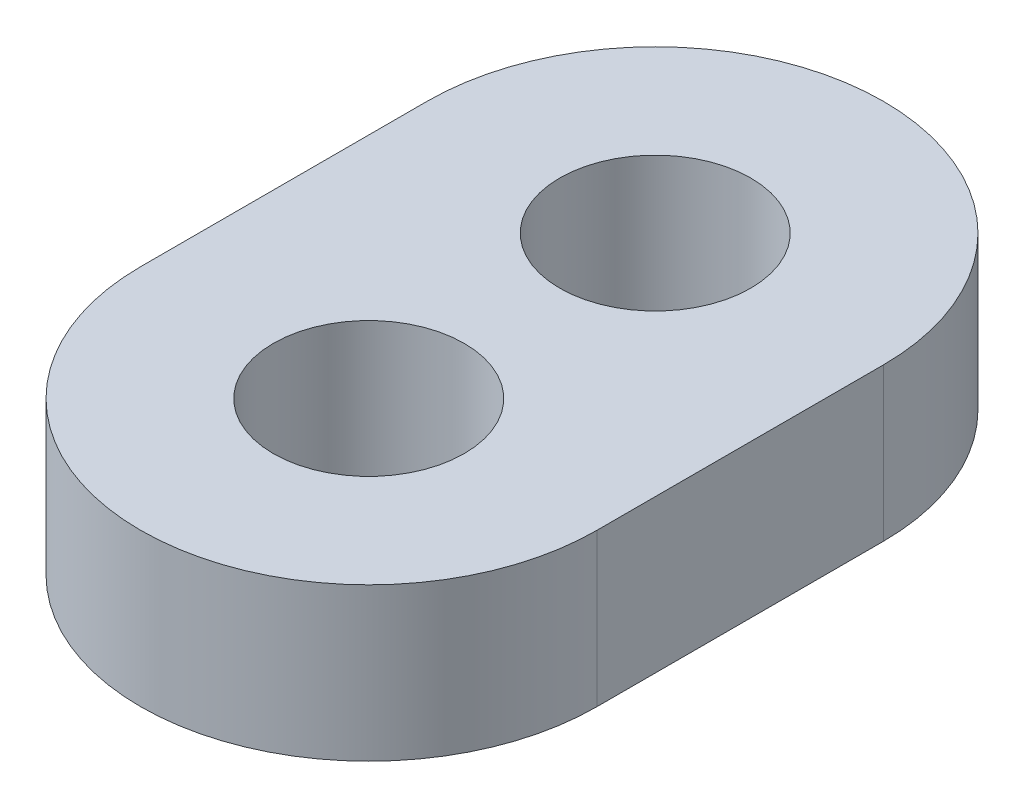
ISO-10303-21;
HEADER;
FILE_DESCRIPTION(('STEP AP214'),'2;1');
FILE_NAME('part.step','',(''),(''),'','','');
FILE_SCHEMA(('AUTOMOTIVE_DESIGN { 1 0 10303 214 1 1 1 1 }'));
ENDSEC;
DATA;
#1=APPLICATION_CONTEXT('core data for automotive mechanical design processes');
#2=APPLICATION_PROTOCOL_DEFINITION('international standard','automotive_design',2000,#1);
#3=PRODUCT_CONTEXT('',#1,'mechanical');
#4=PRODUCT('Part','Part','',(#3));
#5=PRODUCT_RELATED_PRODUCT_CATEGORY('part','',(#4));
#6=PRODUCT_DEFINITION_FORMATION('','',#4);
#7=PRODUCT_DEFINITION_CONTEXT('part definition',#1,'design');
#8=PRODUCT_DEFINITION('design','',#6,#7);
#9=PRODUCT_DEFINITION_SHAPE('','',#8);
#10=(LENGTH_UNIT() NAMED_UNIT(*) SI_UNIT(.MILLI.,.METRE.));
#11=(NAMED_UNIT(*) PLANE_ANGLE_UNIT() SI_UNIT($,.RADIAN.));
#12=(NAMED_UNIT(*) SI_UNIT($,.STERADIAN.) SOLID_ANGLE_UNIT());
#13=UNCERTAINTY_MEASURE_WITH_UNIT(LENGTH_MEASURE(1.E-05),#10,'distance_accuracy_value','');
#14=(GEOMETRIC_REPRESENTATION_CONTEXT(3) GLOBAL_UNCERTAINTY_ASSIGNED_CONTEXT((#13)) GLOBAL_UNIT_ASSIGNED_CONTEXT((#10,
#11,#12)) REPRESENTATION_CONTEXT('',''));
#15=CARTESIAN_POINT('',(0.,0.,0.));
#16=DIRECTION('',(0.,0.,1.));
#17=DIRECTION('',(1.,0.,0.));
#18=AXIS2_PLACEMENT_3D('',#15,#16,#17);
#19=CARTESIAN_POINT('',(0.,-9.,-6.5));
#20=DIRECTION('',(0.,-1.,0.));
#21=DIRECTION('',(0.,0.,-1.));
#22=AXIS2_PLACEMENT_3D('',#19,#20,#21);
#23=PLANE('',#22);
#24=CARTESIAN_POINT('',(0.,-9.,-14.));
#25=DIRECTION('',(0.,-1.,0.));
#26=DIRECTION('',(0.,0.,-1.));
#27=AXIS2_PLACEMENT_3D('',#24,#25,#26);
#28=CIRCLE('',#27,2.5);
#29=CARTESIAN_POINT('',(0.,-9.,-16.5));
#30=VERTEX_POINT('',#29);
#31=EDGE_CURVE('E100',#30,#30,#28,.T.);
#32=ORIENTED_EDGE('',*,*,#31,.F.);
#33=EDGE_LOOP('',(#32));
#34=FACE_BOUND('',#33,.T.);
#35=CARTESIAN_POINT('',(0.,-9.,-6.5));
#36=DIRECTION('',(0.,-1.,0.));
#37=DIRECTION('',(0.,0.,-1.));
#38=AXIS2_PLACEMENT_3D('',#35,#36,#37);
#39=CIRCLE('',#38,5.9750628465971);
#40=CARTESIAN_POINT('',(5.9750628465971,-9.,-6.5));
#41=VERTEX_POINT('',#40);
#42=CARTESIAN_POINT('',(-5.9750628465971,-9.,-6.5));
#43=VERTEX_POINT('',#42);
#44=EDGE_CURVE('E85',#41,#43,#39,.T.);
#45=ORIENTED_EDGE('',*,*,#44,.T.);
#46=DIRECTION('',(0.,0.,-1.));
#47=VECTOR('',#46,1.);
#48=CARTESIAN_POINT('',(-5.9750628465971,-9.,-6.5));
#49=LINE('',#48,#47);
#50=CARTESIAN_POINT('',(-5.9750628465971,-9.,-14.));
#51=VERTEX_POINT('',#50);
#52=EDGE_CURVE('E80',#43,#51,#49,.T.);
#53=ORIENTED_EDGE('',*,*,#52,.T.);
#54=CARTESIAN_POINT('',(0.,-9.,-14.));
#55=DIRECTION('',(0.,-1.,0.));
#56=DIRECTION('',(0.,0.,-1.));
#57=AXIS2_PLACEMENT_3D('',#54,#55,#56);
#58=CIRCLE('',#57,5.9750628465971);
#59=CARTESIAN_POINT('',(5.9750628465971,-9.,-14.));
#60=VERTEX_POINT('',#59);
#61=EDGE_CURVE('E83',#51,#60,#58,.T.);
#62=ORIENTED_EDGE('',*,*,#61,.T.);
#63=DIRECTION('',(0.,0.,1.));
#64=VECTOR('',#63,1.);
#65=CARTESIAN_POINT('',(5.9750628465971,-9.,-6.5));
#66=LINE('',#65,#64);
#67=EDGE_CURVE('E50',#60,#41,#66,.T.);
#68=ORIENTED_EDGE('',*,*,#67,.T.);
#69=EDGE_LOOP('',(#45,#53,#62,#68));
#70=FACE_BOUND('',#69,.T.);
#71=CARTESIAN_POINT('',(0.,-9.,-6.5));
#72=DIRECTION('',(0.,-1.,0.));
#73=DIRECTION('',(0.,0.,-1.));
#74=AXIS2_PLACEMENT_3D('',#71,#72,#73);
#75=CIRCLE('',#74,2.5);
#76=CARTESIAN_POINT('',(0.,-9.,-9.));
#77=VERTEX_POINT('',#76);
#78=EDGE_CURVE('E115',#77,#77,#75,.T.);
#79=ORIENTED_EDGE('',*,*,#78,.F.);
#80=EDGE_LOOP('',(#79));
#81=FACE_BOUND('',#80,.T.);
#82=ADVANCED_FACE('F33',(#34,#70,#81),#23,.T.);
#83=CARTESIAN_POINT('',(0.,-5.,-6.5));
#84=DIRECTION('',(0.,-1.,0.));
#85=DIRECTION('',(0.,0.,-1.));
#86=AXIS2_PLACEMENT_3D('',#83,#84,#85);
#87=PLANE('',#86);
#88=CARTESIAN_POINT('',(0.,-5.,-14.));
#89=DIRECTION('',(0.,-1.,0.));
#90=DIRECTION('',(0.,0.,-1.));
#91=AXIS2_PLACEMENT_3D('',#88,#89,#90);
#92=CIRCLE('',#91,2.5);
#93=CARTESIAN_POINT('',(0.,-5.,-16.5));
#94=VERTEX_POINT('',#93);
#95=EDGE_CURVE('E112',#94,#94,#92,.T.);
#96=ORIENTED_EDGE('',*,*,#95,.T.);
#97=EDGE_LOOP('',(#96));
#98=FACE_BOUND('',#97,.T.);
#99=CARTESIAN_POINT('',(0.,-5.,-6.5));
#100=DIRECTION('',(0.,-1.,0.));
#101=DIRECTION('',(0.,0.,-1.));
#102=AXIS2_PLACEMENT_3D('',#99,#100,#101);
#103=CIRCLE('',#102,5.9750628465971);
#104=CARTESIAN_POINT('',(5.9750628465971,-5.,-6.5));
#105=VERTEX_POINT('',#104);
#106=CARTESIAN_POINT('',(-5.9750628465971,-5.,-6.5));
#107=VERTEX_POINT('',#106);
#108=EDGE_CURVE('E97',#105,#107,#103,.T.);
#109=ORIENTED_EDGE('',*,*,#108,.F.);
#110=DIRECTION('',(0.,0.,1.));
#111=VECTOR('',#110,1.);
#112=CARTESIAN_POINT('',(5.9750628465971,-5.,-6.5));
#113=LINE('',#112,#111);
#114=CARTESIAN_POINT('',(5.9750628465971,-5.,-14.));
#115=VERTEX_POINT('',#114);
#116=EDGE_CURVE('E73',#115,#105,#113,.T.);
#117=ORIENTED_EDGE('',*,*,#116,.F.);
#118=CARTESIAN_POINT('',(0.,-5.,-14.));
#119=DIRECTION('',(0.,-1.,0.));
#120=DIRECTION('',(0.,0.,-1.));
#121=AXIS2_PLACEMENT_3D('',#118,#119,#120);
#122=CIRCLE('',#121,5.9750628465971);
#123=CARTESIAN_POINT('',(-5.9750628465971,-5.,-14.));
#124=VERTEX_POINT('',#123);
#125=EDGE_CURVE('E67',#124,#115,#122,.T.);
#126=ORIENTED_EDGE('',*,*,#125,.F.);
#127=DIRECTION('',(0.,0.,-1.));
#128=VECTOR('',#127,1.);
#129=CARTESIAN_POINT('',(-5.9750628465971,-5.,-6.5));
#130=LINE('',#129,#128);
#131=EDGE_CURVE('E89',#107,#124,#130,.T.);
#132=ORIENTED_EDGE('',*,*,#131,.F.);
#133=EDGE_LOOP('',(#109,#117,#126,#132));
#134=FACE_BOUND('',#133,.T.);
#135=CARTESIAN_POINT('',(0.,-5.,-6.5));
#136=DIRECTION('',(0.,-1.,0.));
#137=DIRECTION('',(0.,0.,-1.));
#138=AXIS2_PLACEMENT_3D('',#135,#136,#137);
#139=CIRCLE('',#138,2.5);
#140=CARTESIAN_POINT('',(0.,-5.,-9.));
#141=VERTEX_POINT('',#140);
#142=EDGE_CURVE('E118',#141,#141,#139,.T.);
#143=ORIENTED_EDGE('',*,*,#142,.T.);
#144=EDGE_LOOP('',(#143));
#145=FACE_BOUND('',#144,.T.);
#146=ADVANCED_FACE('F108',(#98,#134,#145),#87,.F.);
#147=CARTESIAN_POINT('',(0.,-9.,-6.5));
#148=DIRECTION('',(0.,1.,0.));
#149=DIRECTION('',(0.,0.,1.));
#150=AXIS2_PLACEMENT_3D('',#147,#148,#149);
#151=CYLINDRICAL_SURFACE('',#150,5.9750628465971);
#152=ORIENTED_EDGE('',*,*,#108,.T.);
#153=DIRECTION('',(0.,1.,0.));
#154=VECTOR('',#153,1.);
#155=CARTESIAN_POINT('',(-5.9750628465971,-9.,-6.5));
#156=LINE('',#155,#154);
#157=EDGE_CURVE('E11',#43,#107,#156,.T.);
#158=ORIENTED_EDGE('',*,*,#157,.F.);
#159=ORIENTED_EDGE('',*,*,#44,.F.);
#160=DIRECTION('',(0.,1.,0.));
#161=VECTOR('',#160,1.);
#162=CARTESIAN_POINT('',(5.9750628465971,-9.,-6.5));
#163=LINE('',#162,#161);
#164=EDGE_CURVE('E93',#41,#105,#163,.T.);
#165=ORIENTED_EDGE('',*,*,#164,.T.);
#166=EDGE_LOOP('',(#152,#158,#159,#165));
#167=FACE_BOUND('',#166,.T.);
#168=ADVANCED_FACE('F35',(#167),#151,.T.);
#169=CARTESIAN_POINT('',(-5.9750628465971,-9.,-6.5));
#170=DIRECTION('',(1.,0.,0.));
#171=DIRECTION('',(0.,0.,-1.));
#172=AXIS2_PLACEMENT_3D('',#169,#170,#171);
#173=PLANE('',#172);
#174=ORIENTED_EDGE('',*,*,#131,.T.);
#175=DIRECTION('',(0.,1.,0.));
#176=VECTOR('',#175,1.);
#177=CARTESIAN_POINT('',(-5.9750628465971,-9.,-14.));
#178=LINE('',#177,#176);
#179=EDGE_CURVE('E42',#51,#124,#178,.T.);
#180=ORIENTED_EDGE('',*,*,#179,.F.);
#181=ORIENTED_EDGE('',*,*,#52,.F.);
#182=ORIENTED_EDGE('',*,*,#157,.T.);
#183=EDGE_LOOP('',(#174,#180,#181,#182));
#184=FACE_BOUND('',#183,.T.);
#185=ADVANCED_FACE('F88',(#184),#173,.F.);
#186=CARTESIAN_POINT('',(0.,-9.,-14.));
#187=DIRECTION('',(0.,1.,0.));
#188=DIRECTION('',(0.,0.,1.));
#189=AXIS2_PLACEMENT_3D('',#186,#187,#188);
#190=CYLINDRICAL_SURFACE('',#189,5.9750628465971);
#191=ORIENTED_EDGE('',*,*,#125,.T.);
#192=DIRECTION('',(0.,1.,0.));
#193=VECTOR('',#192,1.);
#194=CARTESIAN_POINT('',(5.9750628465971,-9.,-14.));
#195=LINE('',#194,#193);
#196=EDGE_CURVE('E90',#60,#115,#195,.T.);
#197=ORIENTED_EDGE('',*,*,#196,.F.);
#198=ORIENTED_EDGE('',*,*,#61,.F.);
#199=ORIENTED_EDGE('',*,*,#179,.T.);
#200=EDGE_LOOP('',(#191,#197,#198,#199));
#201=FACE_BOUND('',#200,.T.);
#202=ADVANCED_FACE('F91',(#201),#190,.T.);
#203=CARTESIAN_POINT('',(5.9750628465971,-9.,-6.5));
#204=DIRECTION('',(-1.,0.,0.));
#205=DIRECTION('',(0.,0.,1.));
#206=AXIS2_PLACEMENT_3D('',#203,#204,#205);
#207=PLANE('',#206);
#208=ORIENTED_EDGE('',*,*,#116,.T.);
#209=ORIENTED_EDGE('',*,*,#164,.F.);
#210=ORIENTED_EDGE('',*,*,#67,.F.);
#211=ORIENTED_EDGE('',*,*,#196,.T.);
#212=EDGE_LOOP('',(#208,#209,#210,#211));
#213=FACE_BOUND('',#212,.T.);
#214=ADVANCED_FACE('F105',(#213),#207,.F.);
#215=CARTESIAN_POINT('',(0.,-9.,-14.));
#216=DIRECTION('',(0.,1.,0.));
#217=DIRECTION('',(0.,0.,1.));
#218=AXIS2_PLACEMENT_3D('',#215,#216,#217);
#219=CYLINDRICAL_SURFACE('',#218,2.5);
#220=ORIENTED_EDGE('',*,*,#31,.T.);
#221=EDGE_LOOP('',(#220));
#222=FACE_BOUND('',#221,.T.);
#223=ORIENTED_EDGE('',*,*,#95,.F.);
#224=EDGE_LOOP('',(#223));
#225=FACE_BOUND('',#224,.T.);
#226=ADVANCED_FACE('F136',(#222,#225),#219,.F.);
#227=CARTESIAN_POINT('',(0.,-9.,-6.5));
#228=DIRECTION('',(0.,1.,0.));
#229=DIRECTION('',(0.,0.,1.));
#230=AXIS2_PLACEMENT_3D('',#227,#228,#229);
#231=CYLINDRICAL_SURFACE('',#230,2.5);
#232=ORIENTED_EDGE('',*,*,#78,.T.);
#233=EDGE_LOOP('',(#232));
#234=FACE_BOUND('',#233,.T.);
#235=ORIENTED_EDGE('',*,*,#142,.F.);
#236=EDGE_LOOP('',(#235));
#237=FACE_BOUND('',#236,.T.);
#238=ADVANCED_FACE('F124',(#234,#237),#231,.F.);
#239=CLOSED_SHELL('',(#82,#146,#168,#185,#202,#214,#226,#238));
#240=MANIFOLD_SOLID_BREP('B2',#239);
#241=ADVANCED_BREP_SHAPE_REPRESENTATION('',(#18,#240),#14);
#242=SHAPE_DEFINITION_REPRESENTATION(#9,#241);
ENDSEC;
END-ISO-10303-21;
